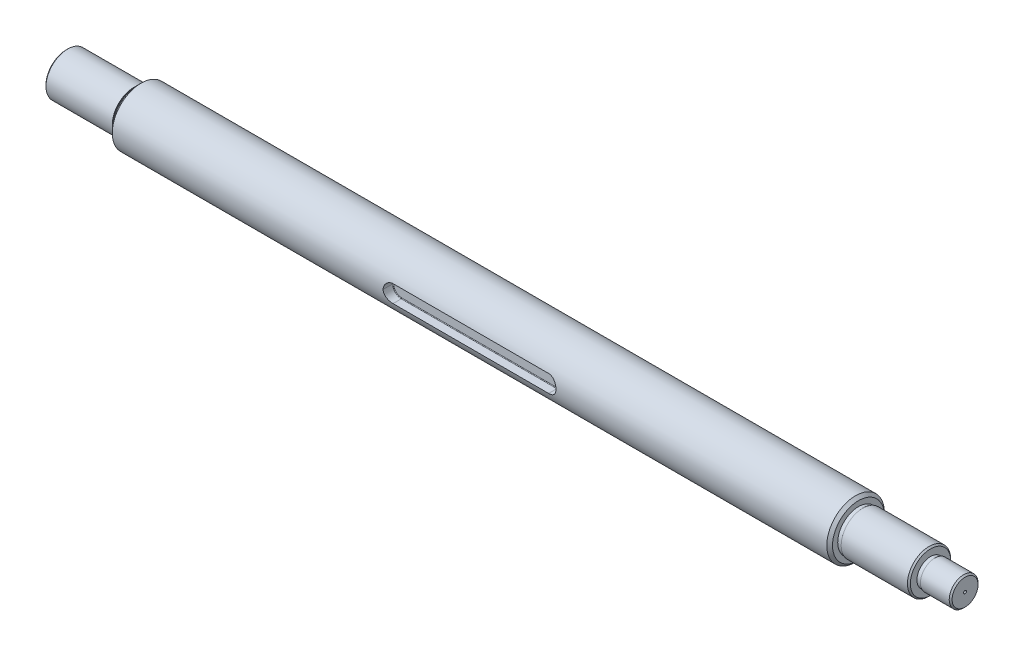
ISO-10303-21;
HEADER;
FILE_DESCRIPTION(('STEP AP214'),'2;1');
FILE_NAME('part.step','',(''),(''),'','','');
FILE_SCHEMA(('AUTOMOTIVE_DESIGN { 1 0 10303 214 1 1 1 1 }'));
ENDSEC;
DATA;
#1=APPLICATION_CONTEXT('core data for automotive mechanical design processes');
#2=APPLICATION_PROTOCOL_DEFINITION('international standard','automotive_design',2000,#1);
#3=PRODUCT_CONTEXT('',#1,'mechanical');
#4=PRODUCT('Part','Part','',(#3));
#5=PRODUCT_RELATED_PRODUCT_CATEGORY('part','',(#4));
#6=PRODUCT_DEFINITION_FORMATION('','',#4);
#7=PRODUCT_DEFINITION_CONTEXT('part definition',#1,'design');
#8=PRODUCT_DEFINITION('design','',#6,#7);
#9=PRODUCT_DEFINITION_SHAPE('','',#8);
#10=(LENGTH_UNIT() NAMED_UNIT(*) SI_UNIT(.MILLI.,.METRE.));
#11=(NAMED_UNIT(*) PLANE_ANGLE_UNIT() SI_UNIT($,.RADIAN.));
#12=(NAMED_UNIT(*) SI_UNIT($,.STERADIAN.) SOLID_ANGLE_UNIT());
#13=UNCERTAINTY_MEASURE_WITH_UNIT(LENGTH_MEASURE(1.E-05),#10,'distance_accuracy_value','');
#14=(GEOMETRIC_REPRESENTATION_CONTEXT(3) GLOBAL_UNCERTAINTY_ASSIGNED_CONTEXT((#13)) GLOBAL_UNIT_ASSIGNED_CONTEXT((#10,
#11,#12)) REPRESENTATION_CONTEXT('',''));
#15=CARTESIAN_POINT('',(0.,0.,0.));
#16=DIRECTION('',(0.,0.,1.));
#17=DIRECTION('',(1.,0.,0.));
#18=AXIS2_PLACEMENT_3D('',#15,#16,#17);
#19=CARTESIAN_POINT('',(26.,0.,0.));
#20=DIRECTION('',(1.,0.,0.));
#21=DIRECTION('',(0.,0.,-1.));
#22=AXIS2_PLACEMENT_3D('',#19,#20,#21);
#23=CONICAL_SURFACE('',#22,10.,0.785398163397455);
#24=CARTESIAN_POINT('',(25.,0.,0.));
#25=DIRECTION('',(-1.,0.,0.));
#26=DIRECTION('',(0.,0.,1.));
#27=AXIS2_PLACEMENT_3D('',#24,#25,#26);
#28=CIRCLE('',#27,9.);
#29=CARTESIAN_POINT('',(25.,0.,9.));
#30=VERTEX_POINT('',#29);
#31=EDGE_CURVE('E152',#30,#30,#28,.T.);
#32=ORIENTED_EDGE('',*,*,#31,.F.);
#33=EDGE_LOOP('',(#32));
#34=FACE_BOUND('',#33,.T.);
#35=CARTESIAN_POINT('',(26.,0.,0.));
#36=DIRECTION('',(-1.,0.,0.));
#37=DIRECTION('',(0.,0.,1.));
#38=AXIS2_PLACEMENT_3D('',#35,#36,#37);
#39=CIRCLE('',#38,10.);
#40=CARTESIAN_POINT('',(26.,0.,10.));
#41=VERTEX_POINT('',#40);
#42=EDGE_CURVE('E137',#41,#41,#39,.T.);
#43=ORIENTED_EDGE('',*,*,#42,.T.);
#44=EDGE_LOOP('',(#43));
#45=FACE_BOUND('',#44,.T.);
#46=ADVANCED_FACE('F46',(#34,#45),#23,.T.);
#47=CARTESIAN_POINT('',(25.,7.5,0.));
#48=DIRECTION('',(1.,0.,0.));
#49=DIRECTION('',(0.,0.,-1.));
#50=AXIS2_PLACEMENT_3D('',#47,#48,#49);
#51=PLANE('',#50);
#52=ORIENTED_EDGE('',*,*,#31,.T.);
#53=EDGE_LOOP('',(#52));
#54=FACE_BOUND('',#53,.T.);
#55=CARTESIAN_POINT('',(25.,0.,0.));
#56=DIRECTION('',(-1.,0.,0.));
#57=DIRECTION('',(0.,0.,1.));
#58=AXIS2_PLACEMENT_3D('',#55,#56,#57);
#59=CIRCLE('',#58,7.2);
#60=CARTESIAN_POINT('',(25.,0.,7.2));
#61=VERTEX_POINT('',#60);
#62=EDGE_CURVE('E140',#61,#61,#59,.T.);
#63=ORIENTED_EDGE('',*,*,#62,.F.);
#64=EDGE_LOOP('',(#63));
#65=FACE_BOUND('',#64,.T.);
#66=ADVANCED_FACE('F322',(#54,#65),#51,.F.);
#67=CARTESIAN_POINT('',(275.,9.,0.));
#68=DIRECTION('',(-1.,0.,0.));
#69=DIRECTION('',(0.,0.,1.));
#70=AXIS2_PLACEMENT_3D('',#67,#68,#69);
#71=PLANE('',#70);
#72=CARTESIAN_POINT('',(275.,0.,0.));
#73=DIRECTION('',(-1.,0.,0.));
#74=DIRECTION('',(0.,0.,1.));
#75=AXIS2_PLACEMENT_3D('',#72,#73,#74);
#76=CIRCLE('',#75,9.);
#77=CARTESIAN_POINT('',(275.,0.,9.));
#78=VERTEX_POINT('',#77);
#79=EDGE_CURVE('E149',#78,#78,#76,.T.);
#80=ORIENTED_EDGE('',*,*,#79,.F.);
#81=EDGE_LOOP('',(#80));
#82=FACE_BOUND('',#81,.T.);
#83=CARTESIAN_POINT('',(275.,0.,0.));
#84=DIRECTION('',(-1.,0.,0.));
#85=DIRECTION('',(0.,0.,1.));
#86=AXIS2_PLACEMENT_3D('',#83,#84,#85);
#87=CIRCLE('',#86,7.2);
#88=CARTESIAN_POINT('',(275.,0.,7.2));
#89=VERTEX_POINT('',#88);
#90=EDGE_CURVE('E366',#89,#89,#87,.T.);
#91=ORIENTED_EDGE('',*,*,#90,.T.);
#92=EDGE_LOOP('',(#91));
#93=FACE_BOUND('',#92,.T.);
#94=ADVANCED_FACE('F328',(#82,#93),#71,.F.);
#95=CARTESIAN_POINT('',(275.,0.,0.));
#96=DIRECTION('',(-1.,0.,0.));
#97=DIRECTION('',(0.,0.,1.));
#98=AXIS2_PLACEMENT_3D('',#95,#96,#97);
#99=CONICAL_SURFACE('',#98,9.,0.785398163397448);
#100=CARTESIAN_POINT('',(274.,0.,0.));
#101=DIRECTION('',(-1.,0.,0.));
#102=DIRECTION('',(0.,0.,1.));
#103=AXIS2_PLACEMENT_3D('',#100,#101,#102);
#104=CIRCLE('',#103,10.);
#105=CARTESIAN_POINT('',(274.,0.,10.));
#106=VERTEX_POINT('',#105);
#107=EDGE_CURVE('E146',#106,#106,#104,.T.);
#108=ORIENTED_EDGE('',*,*,#107,.F.);
#109=EDGE_LOOP('',(#108));
#110=FACE_BOUND('',#109,.T.);
#111=ORIENTED_EDGE('',*,*,#79,.T.);
#112=EDGE_LOOP('',(#111));
#113=FACE_BOUND('',#112,.T.);
#114=ADVANCED_FACE('F417',(#110,#113),#99,.T.);
#115=CARTESIAN_POINT('',(0.,0.,0.));
#116=DIRECTION('',(-1.,0.,0.));
#117=DIRECTION('',(0.,0.,1.));
#118=AXIS2_PLACEMENT_3D('',#115,#116,#117);
#119=CYLINDRICAL_SURFACE('',#118,10.);
#120=CARTESIAN_POINT('',(177.,3.,9.53939201416946));
#121=CARTESIAN_POINT('',(177.082338355279,3.00001028092919,9.53938054066293));
#122=CARTESIAN_POINT('',(177.164670125961,2.9966103938752,9.54045779392469));
#123=CARTESIAN_POINT('',(177.328705222887,2.98307026420713,9.54470448571776));
#124=CARTESIAN_POINT('',(177.410408686318,2.97293153783626,9.54787345361081));
#125=CARTESIAN_POINT('',(177.572398779609,2.94602863460168,9.55620753798556));
#126=CARTESIAN_POINT('',(177.652688538835,2.92928173841086,9.56136744728884));
#127=CARTESIAN_POINT('',(177.811481263025,2.88932692619324,9.57351674919551));
#128=CARTESIAN_POINT('',(177.889984181316,2.86611884160637,9.5805061895276));
#129=CARTESIAN_POINT('',(178.121946806216,2.78708673739489,9.60391611506093));
#130=CARTESIAN_POINT('',(178.272063413037,2.721820780221,9.62278944217779));
#131=CARTESIAN_POINT('',(178.559221477183,2.56815331502609,9.66493136751062));
#132=CARTESIAN_POINT('',(178.696256369005,2.47974027229482,9.68820215546662));
#133=CARTESIAN_POINT('',(178.957721214929,2.27930040049353,9.73733616423825));
#134=CARTESIAN_POINT('',(179.081681454639,2.16667315014813,9.76325431599017));
#135=CARTESIAN_POINT('',(179.309271082785,1.92227974972485,9.81429568962703));
#136=CARTESIAN_POINT('',(179.41289650516,1.79050987481177,9.83941875564023));
#137=CARTESIAN_POINT('',(179.598954878841,1.50818045237192,9.88667183343645));
#138=CARTESIAN_POINT('',(179.680897626502,1.35728471100046,9.90872799691547));
#139=CARTESIAN_POINT('',(179.818013640868,1.04312670278015,9.94670010628166));
#140=CARTESIAN_POINT('',(179.873210097354,0.879875291166895,9.96262136883706));
#141=CARTESIAN_POINT('',(179.942537892135,0.596528917969978,9.98287420040382));
#142=CARTESIAN_POINT('',(179.96404271669,0.47833298430035,9.98925529459184));
#143=CARTESIAN_POINT('',(179.992788049767,0.24011477987629,9.99783635723861));
#144=CARTESIAN_POINT('',(180.000033513555,0.120093158182545,10.0000377781649));
#145=CARTESIAN_POINT('',(180.,0.,10.));
#146=B_SPLINE_CURVE_WITH_KNOTS('',3,(#120,#121,#122,#123,#124,#125,#126,#127,#128,#129,#130,
#131,#132,#133,#134,#135,#136,#137,#138,#139,#140,#141,#142,#143,#144,#145),.UNSPECIFIED.,.F.,
.F.,(4,2,2,2,2,2,2,2,2,2,2,2,4),(0.,0.246926642096038,0.493797744336966,0.740027500587473,
0.986263681104373,1.47812528182602,1.97023245626457,2.47634460283146,2.98255536261056,
3.49938590474304,4.0157675349931,4.37580149197501,4.73571031156629),.UNSPECIFIED.);
#147=CARTESIAN_POINT('',(177.,3.,9.53939201416946));
#148=VERTEX_POINT('',#147);
#149=CARTESIAN_POINT('',(180.,0.,10.));
#150=VERTEX_POINT('',#149);
#151=EDGE_CURVE('E223',#148,#150,#146,.T.);
#152=ORIENTED_EDGE('',*,*,#151,.T.);
#153=CARTESIAN_POINT('',(180.,0.,10.));
#154=CARTESIAN_POINT('',(180.000010082523,-0.0824227631463777,10.0000096080285));
#155=CARTESIAN_POINT('',(179.996603421434,-0.164839419523967,9.99898119564177));
#156=CARTESIAN_POINT('',(179.983034868909,-0.329049154042205,9.99491972682128));
#157=CARTESIAN_POINT('',(179.972874318165,-0.410842352684436,9.99188706824365));
#158=CARTESIAN_POINT('',(179.94590910253,-0.573029010046605,9.98389820327522));
#159=CARTESIAN_POINT('',(179.929120699308,-0.653425395603843,9.97894670536667));
#160=CARTESIAN_POINT('',(179.889062810034,-0.812432937247889,9.96726244195506));
#161=CARTESIAN_POINT('',(179.865793197223,-0.891044058385975,9.96052964161341));
#162=CARTESIAN_POINT('',(179.786538045671,-1.12334751869737,9.93791665572714));
#163=CARTESIAN_POINT('',(179.72107535021,-1.27369353338764,9.91961224749823));
#164=CARTESIAN_POINT('',(179.566947422958,-1.56123419028948,9.87844788158406));
#165=CARTESIAN_POINT('',(179.478272406569,-1.69842325310214,9.85558600377791));
#166=CARTESIAN_POINT('',(179.277558643411,-1.95973032044497,9.8070161559161));
#167=CARTESIAN_POINT('',(179.164978738896,-2.0834225580908,9.78125020543237));
#168=CARTESIAN_POINT('',(178.920792270821,-2.31049087548403,9.73011891154728));
#169=CARTESIAN_POINT('',(178.789180751713,-2.41386164723295,9.70475367439976));
#170=CARTESIAN_POINT('',(178.507012469408,-2.59963260472335,9.65667399274843));
#171=CARTESIAN_POINT('',(178.356092240925,-2.68150106243728,9.6340331517849));
#172=CARTESIAN_POINT('',(178.041890310275,-2.81846982634431,9.59485969620408));
#173=CARTESIAN_POINT('',(177.878620411788,-2.8735953286263,9.57832133561774));
#174=CARTESIAN_POINT('',(177.595464168265,-2.94274344350913,9.55725691110831));
#175=CARTESIAN_POINT('',(177.477492603618,-2.96416883691449,9.5506070073494));
#176=CARTESIAN_POINT('',(177.239705214934,-2.9928125520524,9.54165249238351));
#177=CARTESIAN_POINT('',(177.119889805981,-3.00003402552321,9.53934691720891));
#178=CARTESIAN_POINT('',(177.,-3.,9.53939201416946));
#179=B_SPLINE_CURVE_WITH_KNOTS('',3,(#153,#154,#155,#156,#157,#158,#159,#160,#161,#162,#163,
#164,#165,#166,#167,#168,#169,#170,#171,#172,#173,#174,#175,#176,#177,#178),.UNSPECIFIED.,.F.,
.F.,(4,2,2,2,2,2,2,2,2,2,2,2,4),(0.,0.247181045487864,0.494313038630556,0.740842415978007,
0.98737661528506,1.47989284612469,1.97261702064959,2.47798531493203,2.98348543731961,
3.5005082543835,4.01704300366041,4.37641607170518,4.73570938868941),.UNSPECIFIED.);
#180=CARTESIAN_POINT('',(177.,-3.,9.53939201416946));
#181=VERTEX_POINT('',#180);
#182=EDGE_CURVE('E230',#150,#181,#179,.T.);
#183=ORIENTED_EDGE('',*,*,#182,.T.);
#184=DIRECTION('',(-1.,0.,0.));
#185=VECTOR('',#184,1.);
#186=CARTESIAN_POINT('',(0.,-3.,9.53939201416946));
#187=LINE('',#186,#185);
#188=CARTESIAN_POINT('',(123.,-3.,9.53939201416946));
#189=VERTEX_POINT('',#188);
#190=EDGE_CURVE('E173',#181,#189,#187,.T.);
#191=ORIENTED_EDGE('',*,*,#190,.T.);
#192=CARTESIAN_POINT('',(123.,-3.,9.53939201416946));
#193=CARTESIAN_POINT('',(122.917661644721,-3.00001028092919,9.53938054066293));
#194=CARTESIAN_POINT('',(122.835329874039,-2.9966103938752,9.54045779392469));
#195=CARTESIAN_POINT('',(122.671294777113,-2.98307026420713,9.54470448571776));
#196=CARTESIAN_POINT('',(122.589591313682,-2.97293153783626,9.54787345361081));
#197=CARTESIAN_POINT('',(122.427601220391,-2.94602863460168,9.55620753798556));
#198=CARTESIAN_POINT('',(122.347311461165,-2.92928173841085,9.56136744728884));
#199=CARTESIAN_POINT('',(122.188518736975,-2.88932692619323,9.57351674919551));
#200=CARTESIAN_POINT('',(122.110015818684,-2.86611884160636,9.5805061895276));
#201=CARTESIAN_POINT('',(121.878053193784,-2.78708673739489,9.60391611506093));
#202=CARTESIAN_POINT('',(121.727936586963,-2.72182078022101,9.62278944217779));
#203=CARTESIAN_POINT('',(121.440778522817,-2.5681533150261,9.66493136751062));
#204=CARTESIAN_POINT('',(121.303743630995,-2.47974027229482,9.68820215546662));
#205=CARTESIAN_POINT('',(121.042278785071,-2.27930040049353,9.73733616423825));
#206=CARTESIAN_POINT('',(120.918318545361,-2.16667315014813,9.76325431599017));
#207=CARTESIAN_POINT('',(120.690728917215,-1.92227974972484,9.81429568962703));
#208=CARTESIAN_POINT('',(120.58710349484,-1.79050987481177,9.83941875564023));
#209=CARTESIAN_POINT('',(120.401045121159,-1.50818045237191,9.88667183343645));
#210=CARTESIAN_POINT('',(120.319102373498,-1.35728471100045,9.90872799691547));
#211=CARTESIAN_POINT('',(120.181986359132,-1.04312670278014,9.94670010628166));
#212=CARTESIAN_POINT('',(120.126789902646,-0.879875291166888,9.96262136883706));
#213=CARTESIAN_POINT('',(120.057462107865,-0.596528917969971,9.98287420040382));
#214=CARTESIAN_POINT('',(120.03595728331,-0.478332984300345,9.98925529459184));
#215=CARTESIAN_POINT('',(120.007211950233,-0.240114779876288,9.99783635723861));
#216=CARTESIAN_POINT('',(119.999966486445,-0.120093158182542,10.0000377781649));
#217=CARTESIAN_POINT('',(120.,0.,10.));
#218=B_SPLINE_CURVE_WITH_KNOTS('',3,(#192,#193,#194,#195,#196,#197,#198,#199,#200,#201,#202,
#203,#204,#205,#206,#207,#208,#209,#210,#211,#212,#213,#214,#215,#216,#217),.UNSPECIFIED.,.F.,
.F.,(4,2,2,2,2,2,2,2,2,2,2,2,4),(0.,0.246926642096038,0.493797744336966,0.740027500587502,
0.986263681104387,1.47812528182602,1.97023245626457,2.47634460283145,2.98255536261057,
3.49938590474303,4.0157675349931,4.37580149197501,4.73571031156629),.UNSPECIFIED.);
#219=CARTESIAN_POINT('',(120.,0.,10.));
#220=VERTEX_POINT('',#219);
#221=EDGE_CURVE('E191',#189,#220,#218,.T.);
#222=ORIENTED_EDGE('',*,*,#221,.T.);
#223=CARTESIAN_POINT('',(120.,0.,10.));
#224=CARTESIAN_POINT('',(119.999989917477,0.0824227631463785,10.0000096080285));
#225=CARTESIAN_POINT('',(120.003396578566,0.164839419523966,9.99898119564177));
#226=CARTESIAN_POINT('',(120.016965131091,0.329049154042202,9.99491972682128));
#227=CARTESIAN_POINT('',(120.027125681835,0.410842352684432,9.99188706824365));
#228=CARTESIAN_POINT('',(120.05409089747,0.573029010046603,9.98389820327522));
#229=CARTESIAN_POINT('',(120.070879300692,0.653425395603843,9.97894670536667));
#230=CARTESIAN_POINT('',(120.110937189966,0.812432937247891,9.96726244195506));
#231=CARTESIAN_POINT('',(120.134206802777,0.891044058385975,9.96052964161341));
#232=CARTESIAN_POINT('',(120.213461954329,1.12334751869737,9.93791665572714));
#233=CARTESIAN_POINT('',(120.27892464979,1.27369353338765,9.91961224749823));
#234=CARTESIAN_POINT('',(120.433052577042,1.56123419028948,9.87844788158406));
#235=CARTESIAN_POINT('',(120.52172759343,1.69842325310213,9.85558600377791));
#236=CARTESIAN_POINT('',(120.722441356589,1.95973032044496,9.8070161559161));
#237=CARTESIAN_POINT('',(120.835021261104,2.0834225580908,9.78125020543237));
#238=CARTESIAN_POINT('',(121.079207729179,2.31049087548403,9.73011891154728));
#239=CARTESIAN_POINT('',(121.210819248287,2.41386164723295,9.70475367439976));
#240=CARTESIAN_POINT('',(121.492987530592,2.59963260472334,9.65667399274843));
#241=CARTESIAN_POINT('',(121.643907759075,2.68150106243729,9.6340331517849));
#242=CARTESIAN_POINT('',(121.958109689725,2.81846982634431,9.59485969620407));
#243=CARTESIAN_POINT('',(122.121379588212,2.8735953286263,9.57832133561774));
#244=CARTESIAN_POINT('',(122.404535831735,2.94274344350912,9.55725691110831));
#245=CARTESIAN_POINT('',(122.522507396382,2.96416883691449,9.5506070073494));
#246=CARTESIAN_POINT('',(122.760294785066,2.99281255205241,9.54165249238351));
#247=CARTESIAN_POINT('',(122.880110194019,3.00003402552321,9.53934691720891));
#248=CARTESIAN_POINT('',(123.,3.,9.53939201416946));
#249=B_SPLINE_CURVE_WITH_KNOTS('',3,(#223,#224,#225,#226,#227,#228,#229,#230,#231,#232,#233,
#234,#235,#236,#237,#238,#239,#240,#241,#242,#243,#244,#245,#246,#247,#248),.UNSPECIFIED.,.F.,
.F.,(4,2,2,2,2,2,2,2,2,2,2,2,4),(0.,0.247181045487861,0.494313038630555,0.740842415978007,
0.987376615285058,1.47989284612469,1.9726170206496,2.47798531493202,2.98348543731961,
3.50050825438352,4.01704300366043,4.37641607170518,4.73570938868941),.UNSPECIFIED.);
#250=CARTESIAN_POINT('',(123.,3.,9.53939201416946));
#251=VERTEX_POINT('',#250);
#252=EDGE_CURVE('E184',#220,#251,#249,.T.);
#253=ORIENTED_EDGE('',*,*,#252,.T.);
#254=DIRECTION('',(-1.,0.,0.));
#255=VECTOR('',#254,1.);
#256=CARTESIAN_POINT('',(0.,3.,9.53939201416946));
#257=LINE('',#256,#255);
#258=EDGE_CURVE('E176',#251,#148,#257,.F.);
#259=ORIENTED_EDGE('',*,*,#258,.T.);
#260=EDGE_LOOP('',(#152,#183,#191,#222,#253,#259));
#261=FACE_BOUND('',#260,.T.);
#262=ORIENTED_EDGE('',*,*,#42,.F.);
#263=EDGE_LOOP('',(#262));
#264=FACE_BOUND('',#263,.T.);
#265=ORIENTED_EDGE('',*,*,#107,.T.);
#266=EDGE_LOOP('',(#265));
#267=FACE_BOUND('',#266,.T.);
#268=ADVANCED_FACE('F197',(#261,#264,#267),#119,.T.);
#269=CARTESIAN_POINT('',(23.5,7.5,0.));
#270=DIRECTION('',(1.,0.,0.));
#271=DIRECTION('',(0.,0.,-1.));
#272=AXIS2_PLACEMENT_3D('',#269,#270,#271);
#273=PLANE('',#272);
#274=CARTESIAN_POINT('',(23.5,0.,0.));
#275=DIRECTION('',(-1.,0.,0.));
#276=DIRECTION('',(0.,0.,1.));
#277=AXIS2_PLACEMENT_3D('',#274,#275,#276);
#278=CIRCLE('',#277,7.2);
#279=CARTESIAN_POINT('',(23.5,0.,7.2));
#280=VERTEX_POINT('',#279);
#281=EDGE_CURVE('E134',#280,#280,#278,.T.);
#282=ORIENTED_EDGE('',*,*,#281,.T.);
#283=EDGE_LOOP('',(#282));
#284=FACE_BOUND('',#283,.T.);
#285=CARTESIAN_POINT('',(23.5,0.,0.));
#286=DIRECTION('',(-1.,0.,0.));
#287=DIRECTION('',(0.,0.,1.));
#288=AXIS2_PLACEMENT_3D('',#285,#286,#287);
#289=CIRCLE('',#288,7.5);
#290=CARTESIAN_POINT('',(23.5,0.,7.5));
#291=VERTEX_POINT('',#290);
#292=EDGE_CURVE('E375',#291,#291,#289,.T.);
#293=ORIENTED_EDGE('',*,*,#292,.F.);
#294=EDGE_LOOP('',(#293));
#295=FACE_BOUND('',#294,.T.);
#296=ADVANCED_FACE('F385',(#284,#295),#273,.T.);
#297=CARTESIAN_POINT('',(0.,0.,0.));
#298=DIRECTION('',(-1.,0.,0.));
#299=DIRECTION('',(0.,0.,1.));
#300=AXIS2_PLACEMENT_3D('',#297,#298,#299);
#301=CYLINDRICAL_SURFACE('',#300,7.2);
#302=ORIENTED_EDGE('',*,*,#62,.T.);
#303=EDGE_LOOP('',(#302));
#304=FACE_BOUND('',#303,.T.);
#305=ORIENTED_EDGE('',*,*,#281,.F.);
#306=EDGE_LOOP('',(#305));
#307=FACE_BOUND('',#306,.T.);
#308=ADVANCED_FACE('F380',(#304,#307),#301,.T.);
#309=CARTESIAN_POINT('',(0.5,0.,0.));
#310=DIRECTION('',(-1.,0.,0.));
#311=DIRECTION('',(0.,0.,1.));
#312=AXIS2_PLACEMENT_3D('',#309,#310,#311);
#313=CONICAL_SURFACE('',#312,0.,0.785398163397448);
#314=CARTESIAN_POINT('',(0.,0.,0.));
#315=DIRECTION('',(-1.,0.,0.));
#316=DIRECTION('',(0.,0.,1.));
#317=AXIS2_PLACEMENT_3D('',#314,#315,#316);
#318=CIRCLE('',#317,0.5);
#319=CARTESIAN_POINT('',(0.,0.,0.5));
#320=VERTEX_POINT('',#319);
#321=EDGE_CURVE('E133',#320,#320,#318,.T.);
#322=ORIENTED_EDGE('',*,*,#321,.T.);
#323=EDGE_LOOP('',(#322));
#324=FACE_BOUND('',#323,.T.);
#325=CARTESIAN_POINT('',(0.5,0.,0.));
#326=VERTEX_POINT('',#325);
#327=VERTEX_LOOP('',#326);
#328=FACE_BOUND('',#327,.T.);
#329=ADVANCED_FACE('F384',(#324,#328),#313,.F.);
#330=CARTESIAN_POINT('',(0.,0.,0.));
#331=DIRECTION('',(1.,0.,0.));
#332=DIRECTION('',(0.,0.,-1.));
#333=AXIS2_PLACEMENT_3D('',#330,#331,#332);
#334=PLANE('',#333);
#335=CARTESIAN_POINT('',(0.,0.,0.));
#336=DIRECTION('',(1.,0.,0.));
#337=DIRECTION('',(0.,0.,-1.));
#338=AXIS2_PLACEMENT_3D('',#335,#336,#337);
#339=CIRCLE('',#338,6.99999999999995);
#340=CARTESIAN_POINT('',(0.,0.,-6.99999999999995));
#341=VERTEX_POINT('',#340);
#342=EDGE_CURVE('E167',#341,#341,#339,.F.);
#343=ORIENTED_EDGE('',*,*,#342,.T.);
#344=EDGE_LOOP('',(#343));
#345=FACE_BOUND('',#344,.T.);
#346=ORIENTED_EDGE('',*,*,#321,.F.);
#347=EDGE_LOOP('',(#346));
#348=FACE_BOUND('',#347,.T.);
#349=ADVANCED_FACE('F404',(#345,#348),#334,.F.);
#350=CARTESIAN_POINT('',(0.,0.,0.));
#351=DIRECTION('',(1.,0.,0.));
#352=DIRECTION('',(0.,0.,-1.));
#353=AXIS2_PLACEMENT_3D('',#350,#351,#352);
#354=CONICAL_SURFACE('',#353,6.99999999999995,0.785398163397451);
#355=CARTESIAN_POINT('',(0.500000000000047,0.,0.));
#356=DIRECTION('',(1.,0.,0.));
#357=DIRECTION('',(0.,0.,-1.));
#358=AXIS2_PLACEMENT_3D('',#355,#356,#357);
#359=CIRCLE('',#358,7.5);
#360=CARTESIAN_POINT('',(0.500000000000047,0.,-7.5));
#361=VERTEX_POINT('',#360);
#362=EDGE_CURVE('E170',#361,#361,#359,.T.);
#363=ORIENTED_EDGE('',*,*,#362,.F.);
#364=EDGE_LOOP('',(#363));
#365=FACE_BOUND('',#364,.T.);
#366=ORIENTED_EDGE('',*,*,#342,.F.);
#367=EDGE_LOOP('',(#366));
#368=FACE_BOUND('',#367,.T.);
#369=ADVANCED_FACE('F208',(#365,#368),#354,.T.);
#370=CARTESIAN_POINT('',(0.,0.,0.));
#371=DIRECTION('',(-1.,0.,0.));
#372=DIRECTION('',(0.,0.,1.));
#373=AXIS2_PLACEMENT_3D('',#370,#371,#372);
#374=CYLINDRICAL_SURFACE('',#373,7.5);
#375=ORIENTED_EDGE('',*,*,#362,.T.);
#376=EDGE_LOOP('',(#375));
#377=FACE_BOUND('',#376,.T.);
#378=ORIENTED_EDGE('',*,*,#292,.T.);
#379=EDGE_LOOP('',(#378));
#380=FACE_BOUND('',#379,.T.);
#381=ADVANCED_FACE('F394',(#377,#380),#374,.T.);
#382=CARTESIAN_POINT('',(0.,0.,0.));
#383=DIRECTION('',(-1.,0.,0.));
#384=DIRECTION('',(0.,0.,1.));
#385=AXIS2_PLACEMENT_3D('',#382,#383,#384);
#386=CYLINDRICAL_SURFACE('',#385,7.2);
#387=CARTESIAN_POINT('',(276.5,0.,0.));
#388=DIRECTION('',(-1.,0.,0.));
#389=DIRECTION('',(0.,0.,1.));
#390=AXIS2_PLACEMENT_3D('',#387,#388,#389);
#391=CIRCLE('',#390,7.2);
#392=CARTESIAN_POINT('',(276.5,0.,7.2));
#393=VERTEX_POINT('',#392);
#394=EDGE_CURVE('E362',#393,#393,#391,.T.);
#395=ORIENTED_EDGE('',*,*,#394,.T.);
#396=EDGE_LOOP('',(#395));
#397=FACE_BOUND('',#396,.T.);
#398=ORIENTED_EDGE('',*,*,#90,.F.);
#399=EDGE_LOOP('',(#398));
#400=FACE_BOUND('',#399,.T.);
#401=ADVANCED_FACE('F396',(#397,#400),#386,.T.);
#402=CARTESIAN_POINT('',(276.5,7.5,0.));
#403=DIRECTION('',(-1.,0.,0.));
#404=DIRECTION('',(0.,0.,1.));
#405=AXIS2_PLACEMENT_3D('',#402,#403,#404);
#406=PLANE('',#405);
#407=CARTESIAN_POINT('',(276.5,0.,0.));
#408=DIRECTION('',(-1.,0.,0.));
#409=DIRECTION('',(0.,0.,1.));
#410=AXIS2_PLACEMENT_3D('',#407,#408,#409);
#411=CIRCLE('',#410,7.5);
#412=CARTESIAN_POINT('',(276.5,0.,7.5));
#413=VERTEX_POINT('',#412);
#414=EDGE_CURVE('E360',#413,#413,#411,.T.);
#415=ORIENTED_EDGE('',*,*,#414,.T.);
#416=EDGE_LOOP('',(#415));
#417=FACE_BOUND('',#416,.T.);
#418=ORIENTED_EDGE('',*,*,#394,.F.);
#419=EDGE_LOOP('',(#418));
#420=FACE_BOUND('',#419,.T.);
#421=ADVANCED_FACE('F351',(#417,#420),#406,.T.);
#422=CARTESIAN_POINT('',(300.,7.5,0.));
#423=DIRECTION('',(-1.,0.,0.));
#424=DIRECTION('',(0.,0.,1.));
#425=AXIS2_PLACEMENT_3D('',#422,#423,#424);
#426=PLANE('',#425);
#427=CARTESIAN_POINT('',(300.,0.,0.));
#428=DIRECTION('',(-1.,0.,0.));
#429=DIRECTION('',(0.,0.,1.));
#430=AXIS2_PLACEMENT_3D('',#427,#428,#429);
#431=CIRCLE('',#430,6.99999999999992);
#432=CARTESIAN_POINT('',(300.,0.,6.99999999999992));
#433=VERTEX_POINT('',#432);
#434=EDGE_CURVE('E164',#433,#433,#431,.F.);
#435=ORIENTED_EDGE('',*,*,#434,.T.);
#436=EDGE_LOOP('',(#435));
#437=FACE_BOUND('',#436,.T.);
#438=CARTESIAN_POINT('',(300.,0.,0.));
#439=DIRECTION('',(-1.,0.,0.));
#440=DIRECTION('',(0.,0.,1.));
#441=AXIS2_PLACEMENT_3D('',#438,#439,#440);
#442=CIRCLE('',#441,4.7);
#443=CARTESIAN_POINT('',(300.,0.,4.7));
#444=VERTEX_POINT('',#443);
#445=EDGE_CURVE('E363',#444,#444,#442,.T.);
#446=ORIENTED_EDGE('',*,*,#445,.T.);
#447=EDGE_LOOP('',(#446));
#448=FACE_BOUND('',#447,.T.);
#449=ADVANCED_FACE('F342',(#437,#448),#426,.F.);
#450=CARTESIAN_POINT('',(299.5,0.,0.));
#451=DIRECTION('',(-1.,0.,0.));
#452=DIRECTION('',(0.,0.,1.));
#453=AXIS2_PLACEMENT_3D('',#450,#451,#452);
#454=CONICAL_SURFACE('',#453,7.5,0.78539816339747);
#455=ORIENTED_EDGE('',*,*,#434,.F.);
#456=EDGE_LOOP('',(#455));
#457=FACE_BOUND('',#456,.T.);
#458=CARTESIAN_POINT('',(299.5,0.,0.));
#459=DIRECTION('',(-1.,0.,0.));
#460=DIRECTION('',(0.,0.,1.));
#461=AXIS2_PLACEMENT_3D('',#458,#459,#460);
#462=CIRCLE('',#461,7.5);
#463=CARTESIAN_POINT('',(299.5,0.,7.5));
#464=VERTEX_POINT('',#463);
#465=EDGE_CURVE('E161',#464,#464,#462,.T.);
#466=ORIENTED_EDGE('',*,*,#465,.F.);
#467=EDGE_LOOP('',(#466));
#468=FACE_BOUND('',#467,.T.);
#469=ADVANCED_FACE('F339',(#457,#468),#454,.T.);
#470=CARTESIAN_POINT('',(0.,0.,0.));
#471=DIRECTION('',(-1.,0.,0.));
#472=DIRECTION('',(0.,0.,1.));
#473=AXIS2_PLACEMENT_3D('',#470,#471,#472);
#474=CYLINDRICAL_SURFACE('',#473,7.5);
#475=ORIENTED_EDGE('',*,*,#465,.T.);
#476=EDGE_LOOP('',(#475));
#477=FACE_BOUND('',#476,.T.);
#478=ORIENTED_EDGE('',*,*,#414,.F.);
#479=EDGE_LOOP('',(#478));
#480=FACE_BOUND('',#479,.T.);
#481=ADVANCED_FACE('F341',(#477,#480),#474,.T.);
#482=CARTESIAN_POINT('',(0.,0.,0.));
#483=DIRECTION('',(-1.,0.,0.));
#484=DIRECTION('',(0.,0.,1.));
#485=AXIS2_PLACEMENT_3D('',#482,#483,#484);
#486=CYLINDRICAL_SURFACE('',#485,4.7);
#487=CARTESIAN_POINT('',(301.5,0.,0.));
#488=DIRECTION('',(-1.,0.,0.));
#489=DIRECTION('',(0.,0.,1.));
#490=AXIS2_PLACEMENT_3D('',#487,#488,#489);
#491=CIRCLE('',#490,4.7);
#492=CARTESIAN_POINT('',(301.5,0.,4.7));
#493=VERTEX_POINT('',#492);
#494=EDGE_CURVE('E369',#493,#493,#491,.T.);
#495=ORIENTED_EDGE('',*,*,#494,.T.);
#496=EDGE_LOOP('',(#495));
#497=FACE_BOUND('',#496,.T.);
#498=ORIENTED_EDGE('',*,*,#445,.F.);
#499=EDGE_LOOP('',(#498));
#500=FACE_BOUND('',#499,.T.);
#501=ADVANCED_FACE('F348',(#497,#500),#486,.T.);
#502=CARTESIAN_POINT('',(301.5,5.,0.));
#503=DIRECTION('',(-1.,0.,0.));
#504=DIRECTION('',(0.,0.,1.));
#505=AXIS2_PLACEMENT_3D('',#502,#503,#504);
#506=PLANE('',#505);
#507=CARTESIAN_POINT('',(301.5,0.,0.));
#508=DIRECTION('',(-1.,0.,0.));
#509=DIRECTION('',(0.,0.,1.));
#510=AXIS2_PLACEMENT_3D('',#507,#508,#509);
#511=CIRCLE('',#510,5.);
#512=CARTESIAN_POINT('',(301.5,0.,5.));
#513=VERTEX_POINT('',#512);
#514=EDGE_CURVE('E298',#513,#513,#511,.T.);
#515=ORIENTED_EDGE('',*,*,#514,.T.);
#516=EDGE_LOOP('',(#515));
#517=FACE_BOUND('',#516,.T.);
#518=ORIENTED_EDGE('',*,*,#494,.F.);
#519=EDGE_LOOP('',(#518));
#520=FACE_BOUND('',#519,.T.);
#521=ADVANCED_FACE('F127',(#517,#520),#506,.T.);
#522=CARTESIAN_POINT('',(312.,0.,0.));
#523=DIRECTION('',(1.,0.,0.));
#524=DIRECTION('',(0.,0.,-1.));
#525=AXIS2_PLACEMENT_3D('',#522,#523,#524);
#526=CONICAL_SURFACE('',#525,0.5,0.785398163397448);
#527=CARTESIAN_POINT('',(311.5,0.,0.));
#528=VERTEX_POINT('',#527);
#529=VERTEX_LOOP('',#528);
#530=FACE_BOUND('',#529,.T.);
#531=CARTESIAN_POINT('',(312.,0.,0.));
#532=DIRECTION('',(-1.,0.,0.));
#533=DIRECTION('',(0.,0.,1.));
#534=AXIS2_PLACEMENT_3D('',#531,#532,#533);
#535=CIRCLE('',#534,0.5);
#536=CARTESIAN_POINT('',(312.,0.,0.5));
#537=VERTEX_POINT('',#536);
#538=EDGE_CURVE('E131',#537,#537,#535,.T.);
#539=ORIENTED_EDGE('',*,*,#538,.F.);
#540=EDGE_LOOP('',(#539));
#541=FACE_BOUND('',#540,.T.);
#542=ADVANCED_FACE('F123',(#530,#541),#526,.F.);
#543=CARTESIAN_POINT('',(312.,5.,0.));
#544=DIRECTION('',(-1.,0.,0.));
#545=DIRECTION('',(0.,0.,1.));
#546=AXIS2_PLACEMENT_3D('',#543,#544,#545);
#547=PLANE('',#546);
#548=CARTESIAN_POINT('',(312.,0.,0.));
#549=DIRECTION('',(-1.,0.,0.));
#550=DIRECTION('',(0.,0.,1.));
#551=AXIS2_PLACEMENT_3D('',#548,#549,#550);
#552=CIRCLE('',#551,4.50000000000009);
#553=CARTESIAN_POINT('',(312.,0.,4.50000000000009));
#554=VERTEX_POINT('',#553);
#555=EDGE_CURVE('E158',#554,#554,#552,.F.);
#556=ORIENTED_EDGE('',*,*,#555,.T.);
#557=EDGE_LOOP('',(#556));
#558=FACE_BOUND('',#557,.T.);
#559=ORIENTED_EDGE('',*,*,#538,.T.);
#560=EDGE_LOOP('',(#559));
#561=FACE_BOUND('',#560,.T.);
#562=ADVANCED_FACE('F126',(#558,#561),#547,.F.);
#563=CARTESIAN_POINT('',(311.5,0.,0.));
#564=DIRECTION('',(-1.,0.,0.));
#565=DIRECTION('',(0.,0.,1.));
#566=AXIS2_PLACEMENT_3D('',#563,#564,#565);
#567=CONICAL_SURFACE('',#566,5.,0.785398163397472);
#568=ORIENTED_EDGE('',*,*,#555,.F.);
#569=EDGE_LOOP('',(#568));
#570=FACE_BOUND('',#569,.T.);
#571=CARTESIAN_POINT('',(311.5,0.,0.));
#572=DIRECTION('',(-1.,0.,0.));
#573=DIRECTION('',(0.,0.,1.));
#574=AXIS2_PLACEMENT_3D('',#571,#572,#573);
#575=CIRCLE('',#574,5.);
#576=CARTESIAN_POINT('',(311.5,0.,5.));
#577=VERTEX_POINT('',#576);
#578=EDGE_CURVE('E155',#577,#577,#575,.T.);
#579=ORIENTED_EDGE('',*,*,#578,.F.);
#580=EDGE_LOOP('',(#579));
#581=FACE_BOUND('',#580,.T.);
#582=ADVANCED_FACE('F335',(#570,#581),#567,.T.);
#583=CARTESIAN_POINT('',(0.,0.,0.));
#584=DIRECTION('',(-1.,0.,0.));
#585=DIRECTION('',(0.,0.,1.));
#586=AXIS2_PLACEMENT_3D('',#583,#584,#585);
#587=CYLINDRICAL_SURFACE('',#586,5.);
#588=ORIENTED_EDGE('',*,*,#578,.T.);
#589=EDGE_LOOP('',(#588));
#590=FACE_BOUND('',#589,.T.);
#591=ORIENTED_EDGE('',*,*,#514,.F.);
#592=EDGE_LOOP('',(#591));
#593=FACE_BOUND('',#592,.T.);
#594=ADVANCED_FACE('F337',(#590,#593),#587,.T.);
#595=CARTESIAN_POINT('',(120.,3.,6.5));
#596=DIRECTION('',(0.,1.,0.));
#597=DIRECTION('',(0.,0.,1.));
#598=AXIS2_PLACEMENT_3D('',#595,#596,#597);
#599=PLANE('',#598);
#600=DIRECTION('',(0.,0.,1.));
#601=VECTOR('',#600,1.);
#602=CARTESIAN_POINT('',(123.,3.,6.5));
#603=LINE('',#602,#601);
#604=CARTESIAN_POINT('',(123.,3.,6.7));
#605=VERTEX_POINT('',#604);
#606=EDGE_CURVE('E179',#251,#605,#603,.F.);
#607=ORIENTED_EDGE('',*,*,#606,.T.);
#608=DIRECTION('',(-1.,0.,0.));
#609=VECTOR('',#608,1.);
#610=CARTESIAN_POINT('',(120.,3.,6.7));
#611=LINE('',#610,#609);
#612=CARTESIAN_POINT('',(177.,3.,6.7));
#613=VERTEX_POINT('',#612);
#614=EDGE_CURVE('E256',#605,#613,#611,.F.);
#615=ORIENTED_EDGE('',*,*,#614,.T.);
#616=DIRECTION('',(0.,0.,1.));
#617=VECTOR('',#616,1.);
#618=CARTESIAN_POINT('',(177.,3.,9.53939201416946));
#619=LINE('',#618,#617);
#620=EDGE_CURVE('E311',#613,#148,#619,.T.);
#621=ORIENTED_EDGE('',*,*,#620,.T.);
#622=ORIENTED_EDGE('',*,*,#258,.F.);
#623=EDGE_LOOP('',(#607,#615,#621,#622));
#624=FACE_BOUND('',#623,.T.);
#625=ADVANCED_FACE('F309',(#624),#599,.F.);
#626=CARTESIAN_POINT('',(120.,-3.,6.5));
#627=DIRECTION('',(0.,-1.,0.));
#628=DIRECTION('',(0.,0.,-1.));
#629=AXIS2_PLACEMENT_3D('',#626,#627,#628);
#630=PLANE('',#629);
#631=DIRECTION('',(0.,0.,1.));
#632=VECTOR('',#631,1.);
#633=CARTESIAN_POINT('',(177.,-3.,6.5));
#634=LINE('',#633,#632);
#635=CARTESIAN_POINT('',(177.,-3.,6.7));
#636=VERTEX_POINT('',#635);
#637=EDGE_CURVE('E231',#181,#636,#634,.F.);
#638=ORIENTED_EDGE('',*,*,#637,.T.);
#639=DIRECTION('',(1.,0.,0.));
#640=VECTOR('',#639,1.);
#641=CARTESIAN_POINT('',(120.,-3.,6.7));
#642=LINE('',#641,#640);
#643=CARTESIAN_POINT('',(123.,-3.,6.7));
#644=VERTEX_POINT('',#643);
#645=EDGE_CURVE('E55',#636,#644,#642,.F.);
#646=ORIENTED_EDGE('',*,*,#645,.T.);
#647=DIRECTION('',(0.,0.,1.));
#648=VECTOR('',#647,1.);
#649=CARTESIAN_POINT('',(123.,-3.,9.53939201416946));
#650=LINE('',#649,#648);
#651=EDGE_CURVE('E182',#644,#189,#650,.T.);
#652=ORIENTED_EDGE('',*,*,#651,.T.);
#653=ORIENTED_EDGE('',*,*,#190,.F.);
#654=EDGE_LOOP('',(#638,#646,#652,#653));
#655=FACE_BOUND('',#654,.T.);
#656=ADVANCED_FACE('F317',(#655),#630,.F.);
#657=CARTESIAN_POINT('',(0.,0.,6.5));
#658=DIRECTION('',(0.,0.,1.));
#659=DIRECTION('',(1.,0.,0.));
#660=AXIS2_PLACEMENT_3D('',#657,#658,#659);
#661=PLANE('',#660);
#662=DIRECTION('',(-1.,0.,0.));
#663=VECTOR('',#662,1.);
#664=CARTESIAN_POINT('',(0.,2.8,6.5));
#665=LINE('',#664,#663);
#666=CARTESIAN_POINT('',(177.,2.8,6.5));
#667=VERTEX_POINT('',#666);
#668=CARTESIAN_POINT('',(123.,2.8,6.5));
#669=VERTEX_POINT('',#668);
#670=EDGE_CURVE('E248',#667,#669,#665,.T.);
#671=ORIENTED_EDGE('',*,*,#670,.T.);
#672=CARTESIAN_POINT('',(123.,0.,6.5));
#673=DIRECTION('',(0.,0.,1.));
#674=DIRECTION('',(1.,0.,0.));
#675=AXIS2_PLACEMENT_3D('',#672,#673,#674);
#676=CIRCLE('',#675,2.8);
#677=CARTESIAN_POINT('',(120.2,0.,6.5));
#678=VERTEX_POINT('',#677);
#679=EDGE_CURVE('E250',#669,#678,#676,.T.);
#680=ORIENTED_EDGE('',*,*,#679,.T.);
#681=CARTESIAN_POINT('',(123.,0.,6.5));
#682=DIRECTION('',(0.,0.,1.));
#683=DIRECTION('',(1.,0.,0.));
#684=AXIS2_PLACEMENT_3D('',#681,#682,#683);
#685=CIRCLE('',#684,2.8);
#686=CARTESIAN_POINT('',(123.,-2.8,6.5));
#687=VERTEX_POINT('',#686);
#688=EDGE_CURVE('E237',#678,#687,#685,.T.);
#689=ORIENTED_EDGE('',*,*,#688,.T.);
#690=DIRECTION('',(1.,0.,0.));
#691=VECTOR('',#690,1.);
#692=CARTESIAN_POINT('',(0.,-2.8,6.5));
#693=LINE('',#692,#691);
#694=CARTESIAN_POINT('',(177.,-2.8,6.5));
#695=VERTEX_POINT('',#694);
#696=EDGE_CURVE('E242',#687,#695,#693,.T.);
#697=ORIENTED_EDGE('',*,*,#696,.T.);
#698=CARTESIAN_POINT('',(177.,0.,6.5));
#699=DIRECTION('',(0.,0.,1.));
#700=DIRECTION('',(1.,0.,0.));
#701=AXIS2_PLACEMENT_3D('',#698,#699,#700);
#702=CIRCLE('',#701,2.8);
#703=CARTESIAN_POINT('',(179.8,0.,6.5));
#704=VERTEX_POINT('',#703);
#705=EDGE_CURVE('E244',#695,#704,#702,.T.);
#706=ORIENTED_EDGE('',*,*,#705,.T.);
#707=CARTESIAN_POINT('',(177.,0.,6.5));
#708=DIRECTION('',(0.,0.,1.));
#709=DIRECTION('',(1.,0.,0.));
#710=AXIS2_PLACEMENT_3D('',#707,#708,#709);
#711=CIRCLE('',#710,2.8);
#712=EDGE_CURVE('E246',#704,#667,#711,.T.);
#713=ORIENTED_EDGE('',*,*,#712,.T.);
#714=EDGE_LOOP('',(#671,#680,#689,#697,#706,#713));
#715=FACE_BOUND('',#714,.T.);
#716=ADVANCED_FACE('F213',(#715),#661,.T.);
#717=CARTESIAN_POINT('',(123.,0.,6.5));
#718=DIRECTION('',(0.,0.,-1.));
#719=DIRECTION('',(-1.,0.,0.));
#720=AXIS2_PLACEMENT_3D('',#717,#718,#719);
#721=CYLINDRICAL_SURFACE('',#720,3.);
#722=ORIENTED_EDGE('',*,*,#651,.F.);
#723=CARTESIAN_POINT('',(123.,0.,6.7));
#724=DIRECTION('',(0.,0.,1.));
#725=DIRECTION('',(1.,0.,0.));
#726=AXIS2_PLACEMENT_3D('',#723,#724,#725);
#727=CIRCLE('',#726,3.);
#728=CARTESIAN_POINT('',(120.,0.,6.7));
#729=VERTEX_POINT('',#728);
#730=EDGE_CURVE('E13',#644,#729,#727,.F.);
#731=ORIENTED_EDGE('',*,*,#730,.T.);
#732=DIRECTION('',(0.,0.,1.));
#733=VECTOR('',#732,1.);
#734=CARTESIAN_POINT('',(120.,0.,6.5));
#735=LINE('',#734,#733);
#736=EDGE_CURVE('E240',#220,#729,#735,.F.);
#737=ORIENTED_EDGE('',*,*,#736,.F.);
#738=ORIENTED_EDGE('',*,*,#221,.F.);
#739=EDGE_LOOP('',(#722,#731,#737,#738));
#740=FACE_BOUND('',#739,.T.);
#741=ADVANCED_FACE('F206',(#740),#721,.F.);
#742=CARTESIAN_POINT('',(123.,0.,6.5));
#743=DIRECTION('',(0.,0.,-1.));
#744=DIRECTION('',(-1.,0.,0.));
#745=AXIS2_PLACEMENT_3D('',#742,#743,#744);
#746=CYLINDRICAL_SURFACE('',#745,3.);
#747=ORIENTED_EDGE('',*,*,#736,.T.);
#748=CARTESIAN_POINT('',(123.,0.,6.7));
#749=DIRECTION('',(0.,0.,1.));
#750=DIRECTION('',(1.,0.,0.));
#751=AXIS2_PLACEMENT_3D('',#748,#749,#750);
#752=CIRCLE('',#751,3.);
#753=EDGE_CURVE('E253',#729,#605,#752,.F.);
#754=ORIENTED_EDGE('',*,*,#753,.T.);
#755=ORIENTED_EDGE('',*,*,#606,.F.);
#756=ORIENTED_EDGE('',*,*,#252,.F.);
#757=EDGE_LOOP('',(#747,#754,#755,#756));
#758=FACE_BOUND('',#757,.T.);
#759=ADVANCED_FACE('F201',(#758),#746,.F.);
#760=CARTESIAN_POINT('',(177.,0.,6.5));
#761=DIRECTION('',(0.,0.,-1.));
#762=DIRECTION('',(-1.,0.,0.));
#763=AXIS2_PLACEMENT_3D('',#760,#761,#762);
#764=CYLINDRICAL_SURFACE('',#763,3.);
#765=DIRECTION('',(0.,0.,1.));
#766=VECTOR('',#765,1.);
#767=CARTESIAN_POINT('',(180.,0.,9.53939201416946));
#768=LINE('',#767,#766);
#769=CARTESIAN_POINT('',(180.,0.,6.7));
#770=VERTEX_POINT('',#769);
#771=EDGE_CURVE('E238',#770,#150,#768,.T.);
#772=ORIENTED_EDGE('',*,*,#771,.F.);
#773=CARTESIAN_POINT('',(177.,0.,6.7));
#774=DIRECTION('',(0.,0.,1.));
#775=DIRECTION('',(1.,0.,0.));
#776=AXIS2_PLACEMENT_3D('',#773,#774,#775);
#777=CIRCLE('',#776,3.);
#778=EDGE_CURVE('E70',#770,#636,#777,.F.);
#779=ORIENTED_EDGE('',*,*,#778,.T.);
#780=ORIENTED_EDGE('',*,*,#637,.F.);
#781=ORIENTED_EDGE('',*,*,#182,.F.);
#782=EDGE_LOOP('',(#772,#779,#780,#781));
#783=FACE_BOUND('',#782,.T.);
#784=ADVANCED_FACE('F205',(#783),#764,.F.);
#785=CARTESIAN_POINT('',(177.,0.,6.5));
#786=DIRECTION('',(0.,0.,-1.));
#787=DIRECTION('',(-1.,0.,0.));
#788=AXIS2_PLACEMENT_3D('',#785,#786,#787);
#789=CYLINDRICAL_SURFACE('',#788,3.);
#790=ORIENTED_EDGE('',*,*,#620,.F.);
#791=CARTESIAN_POINT('',(177.,0.,6.7));
#792=DIRECTION('',(0.,0.,1.));
#793=DIRECTION('',(1.,0.,0.));
#794=AXIS2_PLACEMENT_3D('',#791,#792,#793);
#795=CIRCLE('',#794,3.);
#796=EDGE_CURVE('E258',#613,#770,#795,.F.);
#797=ORIENTED_EDGE('',*,*,#796,.T.);
#798=ORIENTED_EDGE('',*,*,#771,.T.);
#799=ORIENTED_EDGE('',*,*,#151,.F.);
#800=EDGE_LOOP('',(#790,#797,#798,#799));
#801=FACE_BOUND('',#800,.T.);
#802=ADVANCED_FACE('F215',(#801),#789,.F.);
#803=CARTESIAN_POINT('',(177.,0.,6.7));
#804=DIRECTION('',(0.,0.,1.));
#805=DIRECTION('',(1.,0.,0.));
#806=AXIS2_PLACEMENT_3D('',#803,#804,#805);
#807=TOROIDAL_SURFACE('',#806,2.8,0.2);
#808=CARTESIAN_POINT('',(177.,-2.8,6.7));
#809=DIRECTION('',(1.,0.,0.));
#810=DIRECTION('',(0.,0.,-1.));
#811=AXIS2_PLACEMENT_3D('',#808,#809,#810);
#812=CIRCLE('',#811,0.2);
#813=EDGE_CURVE('E271',#636,#695,#812,.T.);
#814=ORIENTED_EDGE('',*,*,#813,.F.);
#815=ORIENTED_EDGE('',*,*,#778,.F.);
#816=CARTESIAN_POINT('',(179.8,0.,6.7));
#817=DIRECTION('',(0.,-1.,0.));
#818=DIRECTION('',(0.,0.,-1.));
#819=AXIS2_PLACEMENT_3D('',#816,#817,#818);
#820=CIRCLE('',#819,0.2);
#821=EDGE_CURVE('E50',#704,#770,#820,.T.);
#822=ORIENTED_EDGE('',*,*,#821,.F.);
#823=ORIENTED_EDGE('',*,*,#705,.F.);
#824=EDGE_LOOP('',(#814,#815,#822,#823));
#825=FACE_BOUND('',#824,.T.);
#826=ADVANCED_FACE('F48',(#825),#807,.F.);
#827=CARTESIAN_POINT('',(177.,0.,6.7));
#828=DIRECTION('',(0.,0.,1.));
#829=DIRECTION('',(1.,0.,0.));
#830=AXIS2_PLACEMENT_3D('',#827,#828,#829);
#831=TOROIDAL_SURFACE('',#830,2.8,0.2);
#832=ORIENTED_EDGE('',*,*,#821,.T.);
#833=ORIENTED_EDGE('',*,*,#796,.F.);
#834=CARTESIAN_POINT('',(177.,2.8,6.7));
#835=DIRECTION('',(1.,0.,0.));
#836=DIRECTION('',(0.,0.,-1.));
#837=AXIS2_PLACEMENT_3D('',#834,#835,#836);
#838=CIRCLE('',#837,0.2);
#839=EDGE_CURVE('E269',#667,#613,#838,.T.);
#840=ORIENTED_EDGE('',*,*,#839,.F.);
#841=ORIENTED_EDGE('',*,*,#712,.F.);
#842=EDGE_LOOP('',(#832,#833,#840,#841));
#843=FACE_BOUND('',#842,.T.);
#844=ADVANCED_FACE('F281',(#843),#831,.F.);
#845=CARTESIAN_POINT('',(0.,-2.8,6.7));
#846=DIRECTION('',(1.,0.,0.));
#847=DIRECTION('',(0.,0.,-1.));
#848=AXIS2_PLACEMENT_3D('',#845,#846,#847);
#849=CYLINDRICAL_SURFACE('',#848,0.2);
#850=ORIENTED_EDGE('',*,*,#813,.T.);
#851=ORIENTED_EDGE('',*,*,#696,.F.);
#852=CARTESIAN_POINT('',(123.,-2.8,6.7));
#853=DIRECTION('',(1.,0.,0.));
#854=DIRECTION('',(0.,0.,-1.));
#855=AXIS2_PLACEMENT_3D('',#852,#853,#854);
#856=CIRCLE('',#855,0.2);
#857=EDGE_CURVE('E266',#644,#687,#856,.T.);
#858=ORIENTED_EDGE('',*,*,#857,.F.);
#859=ORIENTED_EDGE('',*,*,#645,.F.);
#860=EDGE_LOOP('',(#850,#851,#858,#859));
#861=FACE_BOUND('',#860,.T.);
#862=ADVANCED_FACE('F286',(#861),#849,.F.);
#863=CARTESIAN_POINT('',(0.,2.8,6.7));
#864=DIRECTION('',(-1.,0.,0.));
#865=DIRECTION('',(0.,0.,1.));
#866=AXIS2_PLACEMENT_3D('',#863,#864,#865);
#867=CYLINDRICAL_SURFACE('',#866,0.2);
#868=ORIENTED_EDGE('',*,*,#839,.T.);
#869=ORIENTED_EDGE('',*,*,#614,.F.);
#870=CARTESIAN_POINT('',(123.,2.8,6.7));
#871=DIRECTION('',(1.,0.,0.));
#872=DIRECTION('',(0.,0.,-1.));
#873=AXIS2_PLACEMENT_3D('',#870,#871,#872);
#874=CIRCLE('',#873,0.2);
#875=EDGE_CURVE('E264',#669,#605,#874,.T.);
#876=ORIENTED_EDGE('',*,*,#875,.F.);
#877=ORIENTED_EDGE('',*,*,#670,.F.);
#878=EDGE_LOOP('',(#868,#869,#876,#877));
#879=FACE_BOUND('',#878,.T.);
#880=ADVANCED_FACE('F306',(#879),#867,.F.);
#881=CARTESIAN_POINT('',(123.,0.,6.7));
#882=DIRECTION('',(0.,0.,1.));
#883=DIRECTION('',(1.,0.,0.));
#884=AXIS2_PLACEMENT_3D('',#881,#882,#883);
#885=TOROIDAL_SURFACE('',#884,2.8,0.2);
#886=ORIENTED_EDGE('',*,*,#857,.T.);
#887=ORIENTED_EDGE('',*,*,#688,.F.);
#888=CARTESIAN_POINT('',(120.2,0.,6.7));
#889=DIRECTION('',(0.,-1.,0.));
#890=DIRECTION('',(0.,0.,-1.));
#891=AXIS2_PLACEMENT_3D('',#888,#889,#890);
#892=CIRCLE('',#891,0.2);
#893=EDGE_CURVE('E262',#729,#678,#892,.T.);
#894=ORIENTED_EDGE('',*,*,#893,.F.);
#895=ORIENTED_EDGE('',*,*,#730,.F.);
#896=EDGE_LOOP('',(#886,#887,#894,#895));
#897=FACE_BOUND('',#896,.T.);
#898=ADVANCED_FACE('F291',(#897),#885,.F.);
#899=CARTESIAN_POINT('',(123.,0.,6.7));
#900=DIRECTION('',(0.,0.,1.));
#901=DIRECTION('',(1.,0.,0.));
#902=AXIS2_PLACEMENT_3D('',#899,#900,#901);
#903=TOROIDAL_SURFACE('',#902,2.8,0.2);
#904=ORIENTED_EDGE('',*,*,#875,.T.);
#905=ORIENTED_EDGE('',*,*,#753,.F.);
#906=ORIENTED_EDGE('',*,*,#893,.T.);
#907=ORIENTED_EDGE('',*,*,#679,.F.);
#908=EDGE_LOOP('',(#904,#905,#906,#907));
#909=FACE_BOUND('',#908,.T.);
#910=ADVANCED_FACE('F300',(#909),#903,.F.);
#911=CLOSED_SHELL('',(#46,#66,#94,#114,#268,#296,#308,#329,#349,#369,#381,#401,#421,#449,#469,
#481,#501,#521,#542,#562,#582,#594,#625,#656,#716,#741,#759,#784,#802,#826,#844,#862,#880,#898,#910));
#912=MANIFOLD_SOLID_BREP('B2',#911);
#913=ADVANCED_BREP_SHAPE_REPRESENTATION('',(#18,#912),#14);
#914=SHAPE_DEFINITION_REPRESENTATION(#9,#913);
ENDSEC;
END-ISO-10303-21;
